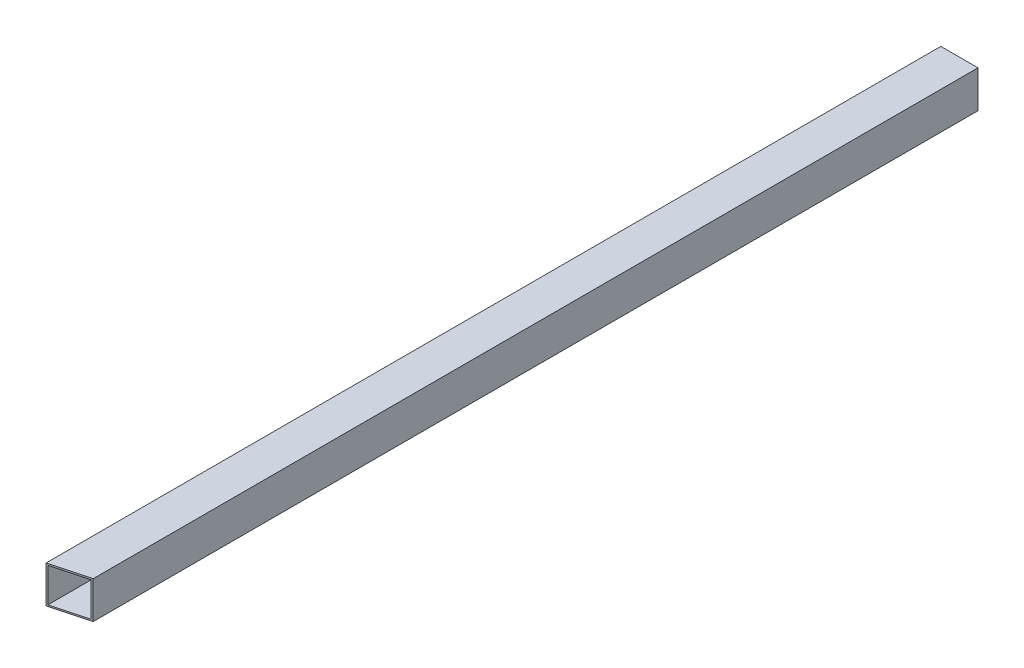
ISO-10303-21;
HEADER;
FILE_DESCRIPTION(('STEP AP214'),'2;1');
FILE_NAME('part.step','',(''),(''),'','','');
FILE_SCHEMA(('AUTOMOTIVE_DESIGN { 1 0 10303 214 1 1 1 1 }'));
ENDSEC;
DATA;
#1=APPLICATION_CONTEXT('core data for automotive mechanical design processes');
#2=APPLICATION_PROTOCOL_DEFINITION('international standard','automotive_design',2000,#1);
#3=PRODUCT_CONTEXT('',#1,'mechanical');
#4=PRODUCT('Part','Part','',(#3));
#5=PRODUCT_RELATED_PRODUCT_CATEGORY('part','',(#4));
#6=PRODUCT_DEFINITION_FORMATION('','',#4);
#7=PRODUCT_DEFINITION_CONTEXT('part definition',#1,'design');
#8=PRODUCT_DEFINITION('design','',#6,#7);
#9=PRODUCT_DEFINITION_SHAPE('','',#8);
#10=(LENGTH_UNIT() NAMED_UNIT(*) SI_UNIT(.MILLI.,.METRE.));
#11=(NAMED_UNIT(*) PLANE_ANGLE_UNIT() SI_UNIT($,.RADIAN.));
#12=(NAMED_UNIT(*) SI_UNIT($,.STERADIAN.) SOLID_ANGLE_UNIT());
#13=UNCERTAINTY_MEASURE_WITH_UNIT(LENGTH_MEASURE(1.E-05),#10,'distance_accuracy_value','');
#14=(GEOMETRIC_REPRESENTATION_CONTEXT(3) GLOBAL_UNCERTAINTY_ASSIGNED_CONTEXT((#13)) GLOBAL_UNIT_ASSIGNED_CONTEXT((#10,
#11,#12)) REPRESENTATION_CONTEXT('',''));
#15=CARTESIAN_POINT('',(0.,0.,0.));
#16=DIRECTION('',(0.,0.,1.));
#17=DIRECTION('',(1.,0.,0.));
#18=AXIS2_PLACEMENT_3D('',#15,#16,#17);
#19=CARTESIAN_POINT('',(1454.,-1767.,10.));
#20=DIRECTION('',(0.,1.,0.));
#21=DIRECTION('',(1.,0.,0.));
#22=AXIS2_PLACEMENT_3D('',#19,#20,#21);
#23=PLANE('',#22);
#24=DIRECTION('',(1.,0.,0.));
#25=VECTOR('',#24,1.);
#26=CARTESIAN_POINT('',(1454.,-1767.,10.));
#27=LINE('',#26,#25);
#28=CARTESIAN_POINT('',(1454.,-1767.,10.));
#29=VERTEX_POINT('',#28);
#30=CARTESIAN_POINT('',(1546.,-1767.,10.));
#31=VERTEX_POINT('',#30);
#32=EDGE_CURVE('E167',#29,#31,#27,.T.);
#33=ORIENTED_EDGE('',*,*,#32,.F.);
#34=DIRECTION('',(0.,0.,1.));
#35=VECTOR('',#34,1.);
#36=CARTESIAN_POINT('',(1454.,-1767.,10.));
#37=LINE('',#36,#35);
#38=CARTESIAN_POINT('',(1454.,-1767.,2416.114005769));
#39=VERTEX_POINT('',#38);
#40=EDGE_CURVE('E21',#29,#39,#37,.T.);
#41=ORIENTED_EDGE('',*,*,#40,.T.);
#42=DIRECTION('',(-0.965925826288944,0.,0.258819045102985));
#43=VECTOR('',#42,1.);
#44=CARTESIAN_POINT('',(1003.823489049,-1767.,2536.73843833));
#45=LINE('',#44,#43);
#46=CARTESIAN_POINT('',(1546.,-1767.,2391.462680066));
#47=VERTEX_POINT('',#46);
#48=EDGE_CURVE('E141',#47,#39,#45,.T.);
#49=ORIENTED_EDGE('',*,*,#48,.F.);
#50=DIRECTION('',(0.,0.,1.));
#51=VECTOR('',#50,1.);
#52=CARTESIAN_POINT('',(1546.,-1767.,10.));
#53=LINE('',#52,#51);
#54=EDGE_CURVE('E11',#31,#47,#53,.T.);
#55=ORIENTED_EDGE('',*,*,#54,.F.);
#56=EDGE_LOOP('',(#33,#41,#49,#55));
#57=FACE_BOUND('',#56,.T.);
#58=ADVANCED_FACE('F17',(#57),#23,.T.);
#59=CARTESIAN_POINT('',(1546.,-1767.,10.));
#60=DIRECTION('',(-1.,0.,0.));
#61=DIRECTION('',(0.,0.,1.));
#62=AXIS2_PLACEMENT_3D('',#59,#60,#61);
#63=PLANE('',#62);
#64=DIRECTION('',(0.,1.,0.));
#65=VECTOR('',#64,1.);
#66=CARTESIAN_POINT('',(1546.,-1767.,10.));
#67=LINE('',#66,#65);
#68=CARTESIAN_POINT('',(1546.,-1675.,10.));
#69=VERTEX_POINT('',#68);
#70=EDGE_CURVE('E165',#31,#69,#67,.T.);
#71=ORIENTED_EDGE('',*,*,#70,.F.);
#72=ORIENTED_EDGE('',*,*,#54,.T.);
#73=DIRECTION('',(0.,-1.,0.));
#74=VECTOR('',#73,1.);
#75=CARTESIAN_POINT('',(1546.,-883.5,2391.462680066));
#76=LINE('',#75,#74);
#77=CARTESIAN_POINT('',(1546.,-1675.,2391.462680066));
#78=VERTEX_POINT('',#77);
#79=EDGE_CURVE('E137',#78,#47,#76,.T.);
#80=ORIENTED_EDGE('',*,*,#79,.F.);
#81=DIRECTION('',(0.,0.,1.));
#82=VECTOR('',#81,1.);
#83=CARTESIAN_POINT('',(1546.,-1675.,10.));
#84=LINE('',#83,#82);
#85=EDGE_CURVE('E28',#69,#78,#84,.T.);
#86=ORIENTED_EDGE('',*,*,#85,.F.);
#87=EDGE_LOOP('',(#71,#72,#80,#86));
#88=FACE_BOUND('',#87,.T.);
#89=ADVANCED_FACE('F19',(#88),#63,.T.);
#90=CARTESIAN_POINT('',(1546.,-1675.,10.));
#91=DIRECTION('',(0.,-1.,0.));
#92=DIRECTION('',(0.,0.,-1.));
#93=AXIS2_PLACEMENT_3D('',#90,#91,#92);
#94=PLANE('',#93);
#95=DIRECTION('',(-1.,0.,0.));
#96=VECTOR('',#95,1.);
#97=CARTESIAN_POINT('',(1546.,-1675.,10.));
#98=LINE('',#97,#96);
#99=CARTESIAN_POINT('',(1454.,-1675.,10.));
#100=VERTEX_POINT('',#99);
#101=EDGE_CURVE('E159',#69,#100,#98,.T.);
#102=ORIENTED_EDGE('',*,*,#101,.F.);
#103=ORIENTED_EDGE('',*,*,#85,.T.);
#104=DIRECTION('',(0.965925826288944,0.,-0.258819045102985));
#105=VECTOR('',#104,1.);
#106=CARTESIAN_POINT('',(1046.742073336,-1675.,2525.23843833));
#107=LINE('',#106,#105);
#108=CARTESIAN_POINT('',(1454.,-1675.,2416.114005769));
#109=VERTEX_POINT('',#108);
#110=EDGE_CURVE('E121',#109,#78,#107,.T.);
#111=ORIENTED_EDGE('',*,*,#110,.F.);
#112=DIRECTION('',(0.,0.,1.));
#113=VECTOR('',#112,1.);
#114=CARTESIAN_POINT('',(1454.,-1675.,10.));
#115=LINE('',#114,#113);
#116=EDGE_CURVE('E110',#100,#109,#115,.T.);
#117=ORIENTED_EDGE('',*,*,#116,.F.);
#118=EDGE_LOOP('',(#102,#103,#111,#117));
#119=FACE_BOUND('',#118,.T.);
#120=ADVANCED_FACE('F155',(#119),#94,.T.);
#121=CARTESIAN_POINT('',(1454.,-1675.,10.));
#122=DIRECTION('',(1.,0.,0.));
#123=DIRECTION('',(0.,1.,0.));
#124=AXIS2_PLACEMENT_3D('',#121,#122,#123);
#125=PLANE('',#124);
#126=DIRECTION('',(0.,-1.,0.));
#127=VECTOR('',#126,1.);
#128=CARTESIAN_POINT('',(1454.,-1675.,10.));
#129=LINE('',#128,#127);
#130=EDGE_CURVE('E295',#100,#29,#129,.T.);
#131=ORIENTED_EDGE('',*,*,#130,.F.);
#132=ORIENTED_EDGE('',*,*,#116,.T.);
#133=DIRECTION('',(0.,1.,0.));
#134=VECTOR('',#133,1.);
#135=CARTESIAN_POINT('',(1454.,-837.5,2416.114005769));
#136=LINE('',#135,#134);
#137=EDGE_CURVE('E111',#39,#109,#136,.T.);
#138=ORIENTED_EDGE('',*,*,#137,.F.);
#139=ORIENTED_EDGE('',*,*,#40,.F.);
#140=EDGE_LOOP('',(#131,#132,#138,#139));
#141=FACE_BOUND('',#140,.T.);
#142=ADVANCED_FACE('F183',(#141),#125,.T.);
#143=CARTESIAN_POINT('',(1550.,-1671.,10.));
#144=DIRECTION('',(0.,-1.,0.));
#145=DIRECTION('',(0.,0.,-1.));
#146=AXIS2_PLACEMENT_3D('',#143,#144,#145);
#147=PLANE('',#146);
#148=DIRECTION('',(0.,0.,1.));
#149=VECTOR('',#148,1.);
#150=CARTESIAN_POINT('',(1450.,-1671.,10.));
#151=LINE('',#150,#149);
#152=CARTESIAN_POINT('',(1450.,-1671.,10.));
#153=VERTEX_POINT('',#152);
#154=CARTESIAN_POINT('',(1450.,-1671.,2417.185802539));
#155=VERTEX_POINT('',#154);
#156=EDGE_CURVE('E99',#153,#155,#151,.T.);
#157=ORIENTED_EDGE('',*,*,#156,.T.);
#158=DIRECTION('',(0.965925826288944,0.,-0.258819045102985));
#159=VECTOR('',#158,1.);
#160=CARTESIAN_POINT('',(1048.60809874,-1671.,2524.73843833));
#161=LINE('',#160,#159);
#162=CARTESIAN_POINT('',(1550.,-1671.,2390.390883296));
#163=VERTEX_POINT('',#162);
#164=EDGE_CURVE('E103',#155,#163,#161,.T.);
#165=ORIENTED_EDGE('',*,*,#164,.T.);
#166=DIRECTION('',(0.,0.,1.));
#167=VECTOR('',#166,1.);
#168=CARTESIAN_POINT('',(1550.,-1671.,10.));
#169=LINE('',#168,#167);
#170=CARTESIAN_POINT('',(1550.,-1671.,10.));
#171=VERTEX_POINT('',#170);
#172=EDGE_CURVE('E131',#171,#163,#169,.T.);
#173=ORIENTED_EDGE('',*,*,#172,.F.);
#174=DIRECTION('',(-1.,0.,0.));
#175=VECTOR('',#174,1.);
#176=CARTESIAN_POINT('',(1550.,-1671.,10.));
#177=LINE('',#176,#175);
#178=EDGE_CURVE('E106',#171,#153,#177,.T.);
#179=ORIENTED_EDGE('',*,*,#178,.T.);
#180=EDGE_LOOP('',(#157,#165,#173,#179));
#181=FACE_BOUND('',#180,.T.);
#182=ADVANCED_FACE('F101',(#181),#147,.F.);
#183=CARTESIAN_POINT('',(1450.,-1671.,10.));
#184=DIRECTION('',(1.,0.,0.));
#185=DIRECTION('',(0.,1.,0.));
#186=AXIS2_PLACEMENT_3D('',#183,#184,#185);
#187=PLANE('',#186);
#188=DIRECTION('',(0.,0.,1.));
#189=VECTOR('',#188,1.);
#190=CARTESIAN_POINT('',(1450.,-1771.,10.));
#191=LINE('',#190,#189);
#192=CARTESIAN_POINT('',(1450.,-1771.,10.));
#193=VERTEX_POINT('',#192);
#194=CARTESIAN_POINT('',(1450.,-1771.,2417.185802539));
#195=VERTEX_POINT('',#194);
#196=EDGE_CURVE('E116',#193,#195,#191,.T.);
#197=ORIENTED_EDGE('',*,*,#196,.T.);
#198=DIRECTION('',(0.,1.,0.));
#199=VECTOR('',#198,1.);
#200=CARTESIAN_POINT('',(1450.,-835.5,2417.185802539));
#201=LINE('',#200,#199);
#202=EDGE_CURVE('E113',#195,#155,#201,.T.);
#203=ORIENTED_EDGE('',*,*,#202,.T.);
#204=ORIENTED_EDGE('',*,*,#156,.F.);
#205=DIRECTION('',(0.,-1.,0.));
#206=VECTOR('',#205,1.);
#207=CARTESIAN_POINT('',(1450.,-1671.,10.));
#208=LINE('',#207,#206);
#209=EDGE_CURVE('E278',#153,#193,#208,.T.);
#210=ORIENTED_EDGE('',*,*,#209,.T.);
#211=EDGE_LOOP('',(#197,#203,#204,#210));
#212=FACE_BOUND('',#211,.T.);
#213=ADVANCED_FACE('F114',(#212),#187,.F.);
#214=CARTESIAN_POINT('',(-47.88152334396,0.,2818.541947077));
#215=DIRECTION('',(-0.258819045102985,0.,-0.965925826288944));
#216=DIRECTION('',(-0.965925826288944,0.,0.258819045102985));
#217=AXIS2_PLACEMENT_3D('',#214,#215,#216);
#218=PLANE('',#217);
#219=ORIENTED_EDGE('',*,*,#110,.T.);
#220=ORIENTED_EDGE('',*,*,#79,.T.);
#221=ORIENTED_EDGE('',*,*,#48,.T.);
#222=ORIENTED_EDGE('',*,*,#137,.T.);
#223=EDGE_LOOP('',(#219,#220,#221,#222));
#224=FACE_BOUND('',#223,.T.);
#225=ORIENTED_EDGE('',*,*,#164,.F.);
#226=ORIENTED_EDGE('',*,*,#202,.F.);
#227=DIRECTION('',(-0.965925826288944,0.,0.258819045102985));
#228=VECTOR('',#227,1.);
#229=CARTESIAN_POINT('',(1001.957463645,-1771.,2537.23843833));
#230=LINE('',#229,#228);
#231=CARTESIAN_POINT('',(1550.,-1771.,2390.390883296));
#232=VERTEX_POINT('',#231);
#233=EDGE_CURVE('E267',#232,#195,#230,.T.);
#234=ORIENTED_EDGE('',*,*,#233,.F.);
#235=DIRECTION('',(0.,-1.,0.));
#236=VECTOR('',#235,1.);
#237=CARTESIAN_POINT('',(1550.,-885.5,2390.390883296));
#238=LINE('',#237,#236);
#239=EDGE_CURVE('E124',#163,#232,#238,.T.);
#240=ORIENTED_EDGE('',*,*,#239,.F.);
#241=EDGE_LOOP('',(#225,#226,#234,#240));
#242=FACE_BOUND('',#241,.T.);
#243=ADVANCED_FACE('F123',(#224,#242),#218,.F.);
#244=CARTESIAN_POINT('',(1550.,-1771.,10.));
#245=DIRECTION('',(-1.,0.,0.));
#246=DIRECTION('',(0.,0.,1.));
#247=AXIS2_PLACEMENT_3D('',#244,#245,#246);
#248=PLANE('',#247);
#249=ORIENTED_EDGE('',*,*,#172,.T.);
#250=ORIENTED_EDGE('',*,*,#239,.T.);
#251=DIRECTION('',(0.,0.,1.));
#252=VECTOR('',#251,1.);
#253=CARTESIAN_POINT('',(1550.,-1771.,10.));
#254=LINE('',#253,#252);
#255=CARTESIAN_POINT('',(1550.,-1771.,10.));
#256=VERTEX_POINT('',#255);
#257=EDGE_CURVE('E266',#256,#232,#254,.T.);
#258=ORIENTED_EDGE('',*,*,#257,.F.);
#259=DIRECTION('',(0.,1.,0.));
#260=VECTOR('',#259,1.);
#261=CARTESIAN_POINT('',(1550.,-1771.,10.));
#262=LINE('',#261,#260);
#263=EDGE_CURVE('E286',#256,#171,#262,.T.);
#264=ORIENTED_EDGE('',*,*,#263,.T.);
#265=EDGE_LOOP('',(#249,#250,#258,#264));
#266=FACE_BOUND('',#265,.T.);
#267=ADVANCED_FACE('F217',(#266),#248,.F.);
#268=CARTESIAN_POINT('',(1500.,-1721.,10.));
#269=DIRECTION('',(0.,0.,1.));
#270=DIRECTION('',(1.,0.,0.));
#271=AXIS2_PLACEMENT_3D('',#268,#269,#270);
#272=PLANE('',#271);
#273=ORIENTED_EDGE('',*,*,#32,.T.);
#274=ORIENTED_EDGE('',*,*,#70,.T.);
#275=ORIENTED_EDGE('',*,*,#101,.T.);
#276=ORIENTED_EDGE('',*,*,#130,.T.);
#277=EDGE_LOOP('',(#273,#274,#275,#276));
#278=FACE_BOUND('',#277,.T.);
#279=ORIENTED_EDGE('',*,*,#209,.F.);
#280=ORIENTED_EDGE('',*,*,#178,.F.);
#281=ORIENTED_EDGE('',*,*,#263,.F.);
#282=DIRECTION('',(1.,0.,0.));
#283=VECTOR('',#282,1.);
#284=CARTESIAN_POINT('',(1450.,-1771.,10.));
#285=LINE('',#284,#283);
#286=EDGE_CURVE('E269',#193,#256,#285,.T.);
#287=ORIENTED_EDGE('',*,*,#286,.F.);
#288=EDGE_LOOP('',(#279,#280,#281,#287));
#289=FACE_BOUND('',#288,.T.);
#290=ADVANCED_FACE('F177',(#278,#289),#272,.F.);
#291=CARTESIAN_POINT('',(1450.,-1771.,10.));
#292=DIRECTION('',(0.,1.,0.));
#293=DIRECTION('',(1.,0.,0.));
#294=AXIS2_PLACEMENT_3D('',#291,#292,#293);
#295=PLANE('',#294);
#296=ORIENTED_EDGE('',*,*,#257,.T.);
#297=ORIENTED_EDGE('',*,*,#233,.T.);
#298=ORIENTED_EDGE('',*,*,#196,.F.);
#299=ORIENTED_EDGE('',*,*,#286,.T.);
#300=EDGE_LOOP('',(#296,#297,#298,#299));
#301=FACE_BOUND('',#300,.T.);
#302=ADVANCED_FACE('F232',(#301),#295,.F.);
#303=CLOSED_SHELL('',(#58,#89,#120,#142,#182,#213,#243,#267,#290,#302));
#304=MANIFOLD_SOLID_BREP('B1',#303);
#305=ADVANCED_BREP_SHAPE_REPRESENTATION('',(#18,#304),#14);
#306=SHAPE_DEFINITION_REPRESENTATION(#9,#305);
ENDSEC;
END-ISO-10303-21;
